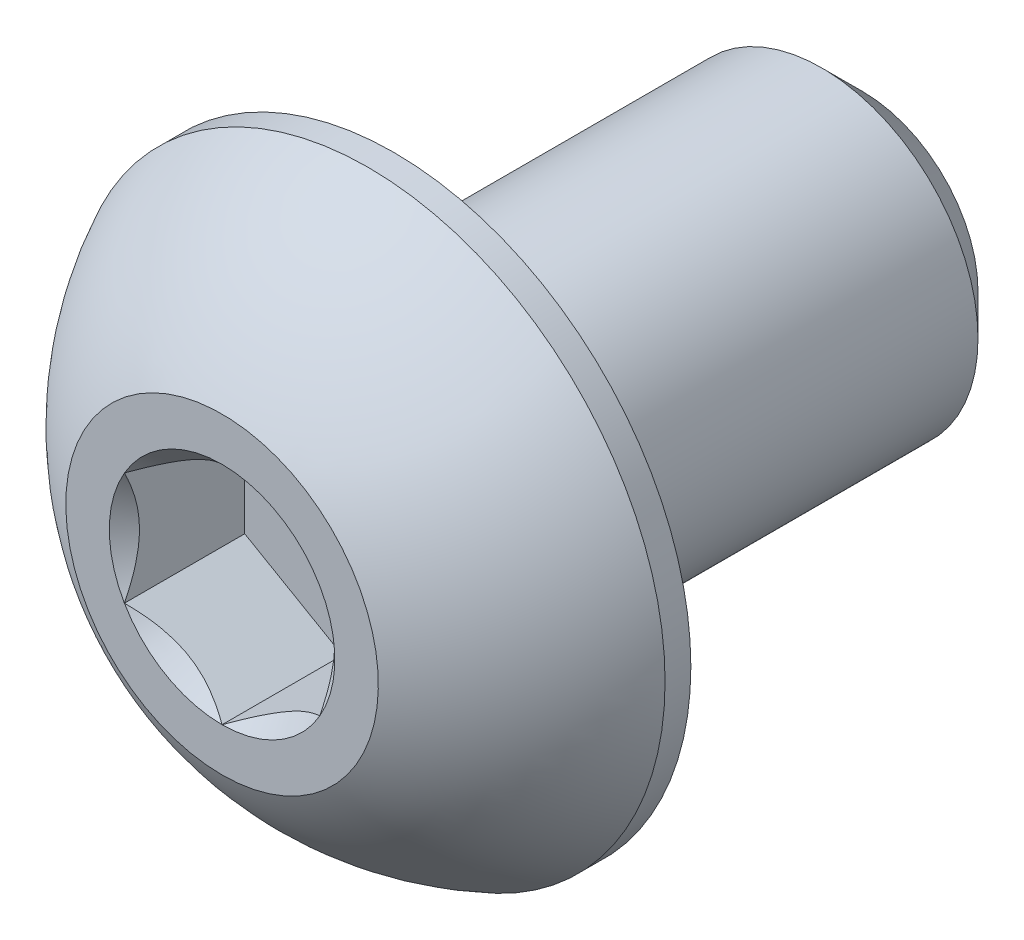
ISO-10303-21;
HEADER;
FILE_DESCRIPTION(('STEP AP214'),'2;1');
FILE_NAME('part.step','',(''),(''),'','','');
FILE_SCHEMA(('AUTOMOTIVE_DESIGN { 1 0 10303 214 1 1 1 1 }'));
ENDSEC;
DATA;
#1=APPLICATION_CONTEXT('core data for automotive mechanical design processes');
#2=APPLICATION_PROTOCOL_DEFINITION('international standard','automotive_design',2000,#1);
#3=PRODUCT_CONTEXT('',#1,'mechanical');
#4=PRODUCT('Part','Part','',(#3));
#5=PRODUCT_RELATED_PRODUCT_CATEGORY('part','',(#4));
#6=PRODUCT_DEFINITION_FORMATION('','',#4);
#7=PRODUCT_DEFINITION_CONTEXT('part definition',#1,'design');
#8=PRODUCT_DEFINITION('design','',#6,#7);
#9=PRODUCT_DEFINITION_SHAPE('','',#8);
#10=(LENGTH_UNIT() NAMED_UNIT(*) SI_UNIT(.MILLI.,.METRE.));
#11=(NAMED_UNIT(*) PLANE_ANGLE_UNIT() SI_UNIT($,.RADIAN.));
#12=(NAMED_UNIT(*) SI_UNIT($,.STERADIAN.) SOLID_ANGLE_UNIT());
#13=UNCERTAINTY_MEASURE_WITH_UNIT(LENGTH_MEASURE(1.E-05),#10,'distance_accuracy_value','');
#14=(GEOMETRIC_REPRESENTATION_CONTEXT(3) GLOBAL_UNCERTAINTY_ASSIGNED_CONTEXT((#13)) GLOBAL_UNIT_ASSIGNED_CONTEXT((#10,
#11,#12)) REPRESENTATION_CONTEXT('',''));
#15=CARTESIAN_POINT('',(0.,0.,0.));
#16=DIRECTION('',(0.,0.,1.));
#17=DIRECTION('',(1.,0.,0.));
#18=AXIS2_PLACEMENT_3D('',#15,#16,#17);
#19=CARTESIAN_POINT('',(0.,0.,-8.2));
#20=DIRECTION('',(0.,0.,1.));
#21=DIRECTION('',(1.,0.,0.));
#22=AXIS2_PLACEMENT_3D('',#19,#20,#21);
#23=PLANE('',#22);
#24=CARTESIAN_POINT('',(0.,0.,-8.2));
#25=DIRECTION('',(0.,0.,1.));
#26=DIRECTION('',(1.,0.,0.));
#27=AXIS2_PLACEMENT_3D('',#24,#25,#26);
#28=CIRCLE('',#27,1.47500000000003);
#29=CARTESIAN_POINT('',(1.47500000000003,0.,-8.2));
#30=VERTEX_POINT('',#29);
#31=EDGE_CURVE('E49',#30,#30,#28,.T.);
#32=ORIENTED_EDGE('',*,*,#31,.F.);
#33=EDGE_LOOP('',(#32));
#34=FACE_BOUND('',#33,.T.);
#35=ADVANCED_FACE('F36',(#34),#23,.F.);
#36=CARTESIAN_POINT('',(0.,0.,-8.2));
#37=DIRECTION('',(0.,0.,1.));
#38=DIRECTION('',(1.,0.,0.));
#39=AXIS2_PLACEMENT_3D('',#36,#37,#38);
#40=CONICAL_SURFACE('',#39,1.47500000000003,0.785398163397434);
#41=CARTESIAN_POINT('',(0.,0.,-7.675));
#42=DIRECTION('',(0.,0.,1.));
#43=DIRECTION('',(1.,0.,0.));
#44=AXIS2_PLACEMENT_3D('',#41,#42,#43);
#45=CIRCLE('',#44,2.00000000000001);
#46=CARTESIAN_POINT('',(2.00000000000001,0.,-7.675));
#47=VERTEX_POINT('',#46);
#48=EDGE_CURVE('E175',#47,#47,#45,.T.);
#49=ORIENTED_EDGE('',*,*,#48,.F.);
#50=EDGE_LOOP('',(#49));
#51=FACE_BOUND('',#50,.T.);
#52=ORIENTED_EDGE('',*,*,#31,.T.);
#53=EDGE_LOOP('',(#52));
#54=FACE_BOUND('',#53,.T.);
#55=ADVANCED_FACE('F180',(#51,#54),#40,.T.);
#56=CARTESIAN_POINT('',(0.,0.,0.));
#57=DIRECTION('',(0.,0.,1.));
#58=DIRECTION('',(1.,0.,0.));
#59=AXIS2_PLACEMENT_3D('',#56,#57,#58);
#60=CYLINDRICAL_SURFACE('',#59,2.00000000000001);
#61=CARTESIAN_POINT('',(0.,0.,-2.2));
#62=DIRECTION('',(0.,0.,1.));
#63=DIRECTION('',(1.,0.,0.));
#64=AXIS2_PLACEMENT_3D('',#61,#62,#63);
#65=CIRCLE('',#64,2.00000000000001);
#66=CARTESIAN_POINT('',(2.00000000000001,0.,-2.2));
#67=VERTEX_POINT('',#66);
#68=EDGE_CURVE('E172',#67,#67,#65,.T.);
#69=ORIENTED_EDGE('',*,*,#68,.F.);
#70=EDGE_LOOP('',(#69));
#71=FACE_BOUND('',#70,.T.);
#72=ORIENTED_EDGE('',*,*,#48,.T.);
#73=EDGE_LOOP('',(#72));
#74=FACE_BOUND('',#73,.T.);
#75=ADVANCED_FACE('F186',(#71,#74),#60,.T.);
#76=CARTESIAN_POINT('',(0.,-3.8,-2.2));
#77=DIRECTION('',(0.,0.,1.));
#78=DIRECTION('',(1.,0.,0.));
#79=AXIS2_PLACEMENT_3D('',#76,#77,#78);
#80=PLANE('',#79);
#81=CARTESIAN_POINT('',(0.,0.,-2.2));
#82=DIRECTION('',(0.,0.,1.));
#83=DIRECTION('',(1.,0.,0.));
#84=AXIS2_PLACEMENT_3D('',#81,#82,#83);
#85=CIRCLE('',#84,3.8);
#86=CARTESIAN_POINT('',(3.8,0.,-2.2));
#87=VERTEX_POINT('',#86);
#88=EDGE_CURVE('E166',#87,#87,#85,.T.);
#89=ORIENTED_EDGE('',*,*,#88,.F.);
#90=EDGE_LOOP('',(#89));
#91=FACE_BOUND('',#90,.T.);
#92=ORIENTED_EDGE('',*,*,#68,.T.);
#93=EDGE_LOOP('',(#92));
#94=FACE_BOUND('',#93,.T.);
#95=ADVANCED_FACE('F191',(#91,#94),#80,.F.);
#96=CARTESIAN_POINT('',(0.,0.,-3.72644385026738));
#97=DIRECTION('',(0.,0.,1.));
#98=DIRECTION('',(0.,-1.,0.));
#99=AXIS2_PLACEMENT_3D('',#96,#97,#98);
#100=SPHERICAL_SURFACE('',#99,4.22922968981299);
#101=CARTESIAN_POINT('',(0.,0.,0.));
#102=DIRECTION('',(0.,0.,1.));
#103=DIRECTION('',(1.,0.,0.));
#104=AXIS2_PLACEMENT_3D('',#101,#102,#103);
#105=CIRCLE('',#104,2.00000000000001);
#106=CARTESIAN_POINT('',(0.,-2.00000000000001,0.));
#107=VERTEX_POINT('',#106);
#108=EDGE_CURVE('E169',#107,#107,#105,.T.);
#109=CARTESIAN_POINT('',(0.,0.,-1.87));
#110=DIRECTION('',(0.,0.,1.));
#111=DIRECTION('',(1.,0.,0.));
#112=AXIS2_PLACEMENT_3D('',#109,#110,#111);
#113=CIRCLE('',#112,3.8);
#114=CARTESIAN_POINT('',(0.,-3.8,-1.87));
#115=VERTEX_POINT('',#114);
#116=EDGE_CURVE('E163',#115,#115,#113,.T.);
#117=CARTESIAN_POINT('',(0.,-2.00000000000001,0.));
#118=CARTESIAN_POINT('',(0.,-2.02421343985615,-0.0129954259644869));
#119=CARTESIAN_POINT('',(0.,-2.04830018323976,-0.0262269129651298));
#120=CARTESIAN_POINT('',(0.,-2.09621120342127,-0.0531568415057489));
#121=CARTESIAN_POINT('',(0.,-2.12003548021918,-0.0668552830457251));
#122=CARTESIAN_POINT('',(0.,-2.16741249358868,-0.0947139531320313));
#123=CARTESIAN_POINT('',(0.,-2.19096523016027,-0.108874181678362));
#124=CARTESIAN_POINT('',(0.,-2.23779021933684,-0.137651035235957));
#125=CARTESIAN_POINT('',(0.,-2.26106247194182,-0.152267660247222));
#126=CARTESIAN_POINT('',(0.,-2.30731764886073,-0.181951755514141));
#127=CARTESIAN_POINT('',(0.,-2.33030057317466,-0.197019225769796));
#128=CARTESIAN_POINT('',(0.,-2.37596836104236,-0.227599285582871));
#129=CARTESIAN_POINT('',(0.,-2.39865322459613,-0.243111875140292));
#130=CARTESIAN_POINT('',(0.,-2.44371627121514,-0.274576279395883));
#131=CARTESIAN_POINT('',(0.,-2.46609445428039,-0.290528094094054));
#132=CARTESIAN_POINT('',(0.,-2.51053563686182,-0.322864887331673));
#133=CARTESIAN_POINT('',(0.,-2.53259863637801,-0.339249865871121));
#134=CARTESIAN_POINT('',(0.,-2.57640106852493,-0.372446760967232));
#135=CARTESIAN_POINT('',(0.,-2.59814050115565,-0.389258677523893));
#136=CARTESIAN_POINT('',(0.,-2.64128753915154,-0.423303060588149));
#137=CARTESIAN_POINT('',(0.,-2.66269514451672,-0.440535527095743));
#138=CARTESIAN_POINT('',(0.,-2.70517039368396,-0.475414462202968));
#139=CARTESIAN_POINT('',(0.,-2.72623803748603,-0.493060930802598));
#140=CARTESIAN_POINT('',(0.,-2.76802535840619,-0.52876116492441));
#141=CARTESIAN_POINT('',(0.,-2.78874503552429,-0.546814930446591));
#142=CARTESIAN_POINT('',(0.,-2.82982855017314,-0.583322898482808));
#143=CARTESIAN_POINT('',(0.,-2.8501923877039,-0.601777100996845));
#144=CARTESIAN_POINT('',(0.,-2.89055648548395,-0.639078930931024));
#145=CARTESIAN_POINT('',(0.,-2.91055674573325,-0.657926558351167));
#146=CARTESIAN_POINT('',(0.,-2.95018608940553,-0.696008076521268));
#147=CARTESIAN_POINT('',(0.,-2.96981517282853,-0.715241967271226));
#148=CARTESIAN_POINT('',(0.,-3.00869470434028,-0.754088703755296));
#149=CARTESIAN_POINT('',(0.,-3.02794515242904,-0.773701549489407));
#150=CARTESIAN_POINT('',(0.,-3.06606009863533,-0.813298743603727));
#151=CARTESIAN_POINT('',(0.,-3.08492459675287,-0.833283091983936));
#152=CARTESIAN_POINT('',(0.,-3.12226047503003,-0.873615697891679));
#153=CARTESIAN_POINT('',(0.,-3.14073185518965,-0.893963955419214));
#154=CARTESIAN_POINT('',(0.,-3.17727447893822,-0.935016647847444));
#155=CARTESIAN_POINT('',(0.,-3.19534572252716,-0.95572108274814));
#156=CARTESIAN_POINT('',(0.,-3.23108120656243,-0.99747826281099));
#157=CARTESIAN_POINT('',(0.,-3.24874544700875,-1.01853100797314));
#158=CARTESIAN_POINT('',(0.,-3.28366021283673,-1.06097680909897));
#159=CARTESIAN_POINT('',(0.,-3.30091073821839,-1.08236986506264));
#160=CARTESIAN_POINT('',(0.,-3.33499151919534,-1.12548815902284));
#161=CARTESIAN_POINT('',(0.,-3.35182177479064,-1.14721339701936));
#162=CARTESIAN_POINT('',(0.,-3.38505562116372,-1.1909878000568));
#163=CARTESIAN_POINT('',(0.,-3.40145921194149,-1.21303696509771));
#164=CARTESIAN_POINT('',(0.,-3.43383349577047,-1.25745084415152));
#165=CARTESIAN_POINT('',(0.,-3.44980418882167,-1.27981555816441));
#166=CARTESIAN_POINT('',(0.,-3.48130660877275,-1.32485203719233));
#167=CARTESIAN_POINT('',(0.,-3.49683833567264,-1.34752380220736));
#168=CARTESIAN_POINT('',(0.,-3.52745692170932,-1.39316576858967));
#169=CARTESIAN_POINT('',(0.,-3.5425437808461,-1.41613596995695));
#170=CARTESIAN_POINT('',(0.,-3.57226689871518,-1.46236608103065));
#171=CARTESIAN_POINT('',(0.,-3.58690315744748,-1.48562599073709));
#172=CARTESIAN_POINT('',(0.,-3.615719513332,-1.5324266802666));
#173=CARTESIAN_POINT('',(0.,-3.62989961048422,-1.55596746008967));
#174=CARTESIAN_POINT('',(0.,-3.65779825442823,-1.6033209453859));
#175=CARTESIAN_POINT('',(0.,-3.67151680122002,-1.62713365085906));
#176=CARTESIAN_POINT('',(0.,-3.69848713452322,-1.67502193787766));
#177=CARTESIAN_POINT('',(0.,-3.71173892103461,-1.6990975194231));
#178=CARTESIAN_POINT('',(0.,-3.73777068821038,-1.74750241579215));
#179=CARTESIAN_POINT('',(0.,-3.75055066887474,-1.77183173061575));
#180=CARTESIAN_POINT('',(0.,-3.77563400658953,-1.82073482944519));
#181=CARTESIAN_POINT('',(0.,-3.78793736363997,-1.84530861345103));
#182=CARTESIAN_POINT('',(0.,-3.8,-1.87));
#183=B_SPLINE_CURVE_WITH_KNOTS('',3,(#117,#118,#119,#120,#121,#122,#123,#124,#125,#126,#127,
#128,#129,#130,#131,#132,#133,#134,#135,#136,#137,#138,#139,#140,#141,#142,#143,#144,#145,#146,
#147,#148,#149,#150,#151,#152,#153,#154,#155,#156,#157,#158,#159,#160,#161,#162,#163,#164,#165,
#166,#167,#168,#169,#170,#171,#172,#173,#174,#175,#176,#177,#178,#179,#180,#181,#182),
.UNSPECIFIED.,.F.,.F.,(4,2,2,2,2,2,2,2,2,2,2,2,2,2,2,2,2,2,2,2,2,2,2,2,2,2,2,2,2,2,2,2,4),(0.,
0.0824398589102638,0.164879717820528,0.247319576730792,0.329759435641056,0.41219929455132,
0.494639153461583,0.577079012371847,0.659518871282112,0.741958730192376,0.82439858910264,
0.906838448012904,0.989278306923168,1.07171816583343,1.1541580247437,1.23659788365396,
1.31903774256422,1.40147760147449,1.48391746038475,1.56635731929502,1.64879717820528,
1.73123703711554,1.81367689602581,1.89611675493607,1.97855661384634,2.0609964727566,
2.14343633166686,2.22587619057713,2.30831604948739,2.39075590839766,2.47319576730792,
2.55563562621818,2.63807548512845),.UNSPECIFIED.);
#184=EDGE_CURVE('BSEAM196',#107,#115,#183,.T.);
#185=ORIENTED_EDGE('',*,*,#108,.F.);
#186=ORIENTED_EDGE('',*,*,#116,.T.);
#187=ORIENTED_EDGE('',*,*,#184,.T.);
#188=ORIENTED_EDGE('',*,*,#184,.F.);
#189=EDGE_LOOP('',(#185,#187,#186,#188));
#190=FACE_BOUND('',#189,.T.);
#191=ADVANCED_FACE('F196',(#190),#100,.T.);
#192=CARTESIAN_POINT('',(0.,-2.00000000000001,0.));
#193=DIRECTION('',(0.,0.,-1.));
#194=DIRECTION('',(-1.,0.,0.));
#195=AXIS2_PLACEMENT_3D('',#192,#193,#194);
#196=PLANE('',#195);
#197=CARTESIAN_POINT('',(0.,0.,0.));
#198=DIRECTION('',(0.,0.,1.));
#199=DIRECTION('',(1.,0.,0.));
#200=AXIS2_PLACEMENT_3D('',#197,#198,#199);
#201=CIRCLE('',#200,1.44337567297406);
#202=CARTESIAN_POINT('',(-1.25,0.721687836487031,0.));
#203=VERTEX_POINT('',#202);
#204=CARTESIAN_POINT('',(-1.25,-0.721687836487033,0.));
#205=VERTEX_POINT('',#204);
#206=EDGE_CURVE('E62',#203,#205,#201,.T.);
#207=ORIENTED_EDGE('',*,*,#206,.F.);
#208=CARTESIAN_POINT('',(0.,1.44337567297406,0.));
#209=VERTEX_POINT('',#208);
#210=EDGE_CURVE('E134',#209,#203,#201,.T.);
#211=ORIENTED_EDGE('',*,*,#210,.F.);
#212=CARTESIAN_POINT('',(1.25,0.721687836487029,0.));
#213=VERTEX_POINT('',#212);
#214=EDGE_CURVE('E131',#213,#209,#201,.T.);
#215=ORIENTED_EDGE('',*,*,#214,.F.);
#216=CARTESIAN_POINT('',(1.25,-0.721687836487029,0.));
#217=VERTEX_POINT('',#216);
#218=EDGE_CURVE('E102',#217,#213,#201,.T.);
#219=ORIENTED_EDGE('',*,*,#218,.F.);
#220=CARTESIAN_POINT('',(0.,-1.44337567297406,0.));
#221=VERTEX_POINT('',#220);
#222=EDGE_CURVE('E94',#221,#217,#201,.T.);
#223=ORIENTED_EDGE('',*,*,#222,.F.);
#224=EDGE_CURVE('E55',#205,#221,#201,.T.);
#225=ORIENTED_EDGE('',*,*,#224,.F.);
#226=EDGE_LOOP('',(#207,#211,#215,#219,#223,#225));
#227=FACE_BOUND('',#226,.T.);
#228=ORIENTED_EDGE('',*,*,#108,.T.);
#229=EDGE_LOOP('',(#228));
#230=FACE_BOUND('',#229,.T.);
#231=ADVANCED_FACE('F128',(#227,#230),#196,.F.);
#232=CARTESIAN_POINT('',(0.,0.,0.));
#233=DIRECTION('',(0.,0.,1.));
#234=DIRECTION('',(1.,0.,0.));
#235=AXIS2_PLACEMENT_3D('',#232,#233,#234);
#236=CYLINDRICAL_SURFACE('',#235,3.8);
#237=ORIENTED_EDGE('',*,*,#116,.F.);
#238=EDGE_LOOP('',(#237));
#239=FACE_BOUND('',#238,.T.);
#240=ORIENTED_EDGE('',*,*,#88,.T.);
#241=EDGE_LOOP('',(#240));
#242=FACE_BOUND('',#241,.T.);
#243=ADVANCED_FACE('F202',(#239,#242),#236,.T.);
#244=CARTESIAN_POINT('',(0.,0.,0.));
#245=DIRECTION('',(0.,0.,1.));
#246=DIRECTION('',(1.,0.,0.));
#247=AXIS2_PLACEMENT_3D('',#244,#245,#246);
#248=CONICAL_SURFACE('',#247,1.44337567297406,0.78539816339745);
#249=ORIENTED_EDGE('',*,*,#218,.T.);
#250=CARTESIAN_POINT('',(1.25,-1.43934010808076,0.462982096892323));
#251=CARTESIAN_POINT('',(1.25,-1.40429313005658,0.436524922632886));
#252=CARTESIAN_POINT('',(1.25,-1.36905087135598,0.410327160354276));
#253=CARTESIAN_POINT('',(1.25,-1.2980965070631,0.358557571839581));
#254=CARTESIAN_POINT('',(1.25,-1.26238428576495,0.332985904356291));
#255=CARTESIAN_POINT('',(1.25,-1.15390111792707,0.257005993689462));
#256=CARTESIAN_POINT('',(1.25,-1.08031646726264,0.207740286189565));
#257=CARTESIAN_POINT('',(1.25,-0.926012322755091,0.111025830263131));
#258=CARTESIAN_POINT('',(1.25,-0.845125318656143,0.0638412989417957));
#259=CARTESIAN_POINT('',(1.25,-0.679311174076599,-0.0224692656095865));
#260=CARTESIAN_POINT('',(1.25,-0.594398891026685,-0.0616224653730992));
#261=CARTESIAN_POINT('',(1.25,-0.466944812460738,-0.109522776311707));
#262=CARTESIAN_POINT('',(1.25,-0.426289985812819,-0.123270510213663));
#263=CARTESIAN_POINT('',(1.25,-0.343998850091265,-0.147502072549456));
#264=CARTESIAN_POINT('',(1.25,-0.30236247361496,-0.157985676130227));
#265=CARTESIAN_POINT('',(1.25,-0.219052696285663,-0.174969838251702));
#266=CARTESIAN_POINT('',(1.25,-0.177393428474498,-0.18153863952863));
#267=CARTESIAN_POINT('',(1.25,-0.0936293693401902,-0.190564946542239));
#268=CARTESIAN_POINT('',(1.25,-0.0515246558543941,-0.193023159002731));
#269=CARTESIAN_POINT('',(1.25,0.0311890576306333,-0.193645937986714));
#270=CARTESIAN_POINT('',(1.25,0.071796962549932,-0.191962883153752));
#271=CARTESIAN_POINT('',(1.25,0.152668636885198,-0.184731729402085));
#272=CARTESIAN_POINT('',(1.25,0.192932338835359,-0.179182889586891));
#273=CARTESIAN_POINT('',(1.25,0.273499879165296,-0.164428963535045));
#274=CARTESIAN_POINT('',(1.25,0.313792180618512,-0.155161824035893));
#275=CARTESIAN_POINT('',(1.25,0.393496413911458,-0.133463821542651));
#276=CARTESIAN_POINT('',(1.25,0.43290841911506,-0.121033223269353));
#277=CARTESIAN_POINT('',(1.25,0.556992735862299,-0.0772206470685609));
#278=CARTESIAN_POINT('',(1.25,0.639898924666086,-0.0408489271240422));
#279=CARTESIAN_POINT('',(1.25,0.801816555499702,0.0400191621783368));
#280=CARTESIAN_POINT('',(1.25,0.880812666325045,0.084544720911988));
#281=CARTESIAN_POINT('',(1.25,1.0317856127975,0.176404876666627));
#282=CARTESIAN_POINT('',(1.25,1.10391618485086,0.223489933916251));
#283=CARTESIAN_POINT('',(1.25,1.21018606043311,0.29627856159854));
#284=CARTESIAN_POINT('',(1.25,1.24515069969379,0.32079808539336));
#285=CARTESIAN_POINT('',(1.25,1.31460220852737,0.370485636765682));
#286=CARTESIAN_POINT('',(1.25,1.34908920596618,0.395653485415522));
#287=CARTESIAN_POINT('',(1.25,1.38337731682912,0.421090148841215));
#288=B_SPLINE_CURVE_WITH_KNOTS('',3,(#250,#251,#252,#253,#254,#255,#256,#257,#258,#259,#260,
#261,#262,#263,#264,#265,#266,#267,#268,#269,#270,#271,#272,#273,#274,#275,#276,#277,#278,#279,
#280,#281,#282,#283,#284,#285,#286,#287),.UNSPECIFIED.,.F.,.F.,(4,2,2,2,2,2,2,2,2,2,2,2,2,2,2,2,
2,2,4),(0.,0.131732960381447,0.263498984161643,0.529042014455823,0.809741926134614,
1.08947609717225,1.21811634272576,1.346765447839,1.47310084517843,1.59941451973784,
1.72115042167849,1.84290966131734,1.96679153905341,2.09066305366038,2.36146692896008,
2.6332598919849,2.89154668212278,3.01965734507712,3.14773302245627),.UNSPECIFIED.);
#289=EDGE_CURVE('E11',#217,#213,#288,.T.);
#290=ORIENTED_EDGE('',*,*,#289,.F.);
#291=EDGE_LOOP('',(#249,#290));
#292=FACE_BOUND('',#291,.T.);
#293=ADVANCED_FACE('F106',(#292),#248,.F.);
#294=ORIENTED_EDGE('',*,*,#214,.T.);
#295=CARTESIAN_POINT('',(1.2502,0.721572366433193,0.000115483909137106));
#296=CARTESIAN_POINT('',(1.20722483292841,0.746384090710443,-0.0246783319448953));
#297=CARTESIAN_POINT('',(1.16353099525405,0.771610739653663,-0.0480162655813155));
#298=CARTESIAN_POINT('',(1.07443406915806,0.823050873919154,-0.0907479959154626));
#299=CARTESIAN_POINT('',(1.02902250164294,0.849269254648332,-0.110118007639585));
#300=CARTESIAN_POINT('',(0.93745217906474,0.902137405038635,-0.143299516586522));
#301=CARTESIAN_POINT('',(0.891316759824114,0.928773701756386,-0.157194440947344));
#302=CARTESIAN_POINT('',(0.798029919592407,0.982632884076012,-0.178602717839361));
#303=CARTESIAN_POINT('',(0.75088135086362,1.00985412292348,-0.186132058433213));
#304=CARTESIAN_POINT('',(0.669626443112747,1.05676666578643,-0.192925501949297));
#305=CARTESIAN_POINT('',(0.635625123372058,1.07639733689152,-0.19393144089565));
#306=CARTESIAN_POINT('',(0.567682235567522,1.11562418145499,-0.192238585088681));
#307=CARTESIAN_POINT('',(0.533740682344342,1.1352203463451,-0.189538972784461));
#308=CARTESIAN_POINT('',(0.4661851435425,1.1742235548576,-0.180591069683622));
#309=CARTESIAN_POINT('',(0.432571492713225,1.19363040521232,-0.174339474100294));
#310=CARTESIAN_POINT('',(0.365905361782186,1.23212011385119,-0.158624318586096));
#311=CARTESIAN_POINT('',(0.332853128969704,1.2512028293628,-0.149159379912542));
#312=CARTESIAN_POINT('',(0.248200308399735,1.30007715810653,-0.121068609312414));
#313=CARTESIAN_POINT('',(0.197133507570362,1.32956058931202,-0.100329842547799));
#314=CARTESIAN_POINT('',(0.0969991458867455,1.38737318998519,-0.0536128653285237));
#315=CARTESIAN_POINT('',(0.0479256884217311,1.41570576386268,-0.0276517040532341));
#316=CARTESIAN_POINT('',(-0.000199999999999383,1.4434911430279,0.000115483909135572));
#317=B_SPLINE_CURVE_WITH_KNOTS('',3,(#295,#296,#297,#298,#299,#300,#301,#302,#303,#304,#305,
#306,#307,#308,#309,#310,#311,#312,#313,#314,#315,#316),.UNSPECIFIED.,.F.,.F.,(4,2,2,2,2,2,2,2,
2,2,4),(0.,0.166533409618304,0.334037607289762,0.498880396489699,0.663307919240276,
0.780963963458828,0.898645970148454,1.01643764860773,1.1342799317155,1.32148652032141,
1.50809158792573),.UNSPECIFIED.);
#318=EDGE_CURVE('E133',#213,#209,#317,.T.);
#319=ORIENTED_EDGE('',*,*,#318,.F.);
#320=EDGE_LOOP('',(#294,#319));
#321=FACE_BOUND('',#320,.T.);
#322=ADVANCED_FACE('F289',(#321),#248,.F.);
#323=ORIENTED_EDGE('',*,*,#210,.T.);
#324=CARTESIAN_POINT('',(0.000200000000000433,1.4434911430279,0.000115483909135892));
#325=CARTESIAN_POINT('',(-0.0427751670715862,1.41867941875065,-0.0246783319448965));
#326=CARTESIAN_POINT('',(-0.0864690047459474,1.39345276980743,-0.0480162655813166));
#327=CARTESIAN_POINT('',(-0.175565930841941,1.34201263554194,-0.0907479959154634));
#328=CARTESIAN_POINT('',(-0.220977498357063,1.31579425481276,-0.110118007639586));
#329=CARTESIAN_POINT('',(-0.312547820935259,1.26292610442246,-0.143299516586523));
#330=CARTESIAN_POINT('',(-0.358683240175885,1.23628980770471,-0.157194440947344));
#331=CARTESIAN_POINT('',(-0.451970080407591,1.18243062538508,-0.178602717839361));
#332=CARTESIAN_POINT('',(-0.499118649136379,1.15520938653761,-0.186132058433213));
#333=CARTESIAN_POINT('',(-0.580373556887251,1.10829684367467,-0.192925501949298));
#334=CARTESIAN_POINT('',(-0.61437487662794,1.08866617256958,-0.193931440895651));
#335=CARTESIAN_POINT('',(-0.682317764432476,1.04943932800611,-0.192238585088682));
#336=CARTESIAN_POINT('',(-0.716259317655656,1.02984316311599,-0.189538972784462));
#337=CARTESIAN_POINT('',(-0.783814856457498,0.990839954603498,-0.180591069683623));
#338=CARTESIAN_POINT('',(-0.817428507286774,0.97143310424877,-0.174339474100295));
#339=CARTESIAN_POINT('',(-0.884094638217812,0.932943395609904,-0.158624318586097));
#340=CARTESIAN_POINT('',(-0.917146871030294,0.913860680098299,-0.149159379912542));
#341=CARTESIAN_POINT('',(-1.00179969160026,0.864986351354567,-0.121068609312415));
#342=CARTESIAN_POINT('',(-1.05286649242964,0.835502920149075,-0.1003298425478));
#343=CARTESIAN_POINT('',(-1.15300085411325,0.777690319475907,-0.0536128653285245));
#344=CARTESIAN_POINT('',(-1.20207431157827,0.749357745598416,-0.0276517040532348));
#345=CARTESIAN_POINT('',(-1.2502,0.721572366433194,0.000115483909135054));
#346=B_SPLINE_CURVE_WITH_KNOTS('',3,(#324,#325,#326,#327,#328,#329,#330,#331,#332,#333,#334,
#335,#336,#337,#338,#339,#340,#341,#342,#343,#344,#345),.UNSPECIFIED.,.F.,.F.,(4,2,2,2,2,2,2,2,
2,2,4),(0.,0.166533409618303,0.334037607289761,0.498880396489697,0.663307919240274,
0.780963963458826,0.898645970148452,1.01643764860773,1.13427993171549,1.32148652032141,
1.50809158792573),.UNSPECIFIED.);
#347=EDGE_CURVE('E138',#209,#203,#346,.T.);
#348=ORIENTED_EDGE('',*,*,#347,.F.);
#349=EDGE_LOOP('',(#323,#348));
#350=FACE_BOUND('',#349,.T.);
#351=ADVANCED_FACE('F141',(#350),#248,.F.);
#352=ORIENTED_EDGE('',*,*,#206,.T.);
#353=CARTESIAN_POINT('',(-1.25,-1.43934010808077,0.462982096892325));
#354=CARTESIAN_POINT('',(-1.25,-1.40429313005658,0.436524922632887));
#355=CARTESIAN_POINT('',(-1.25,-1.36905087135599,0.410327160354277));
#356=CARTESIAN_POINT('',(-1.25,-1.29809650706311,0.358557571839583));
#357=CARTESIAN_POINT('',(-1.25,-1.26238428576495,0.332985904356292));
#358=CARTESIAN_POINT('',(-1.25,-1.15390111792708,0.257005993689462));
#359=CARTESIAN_POINT('',(-1.25,-1.08031646726264,0.207740286189565));
#360=CARTESIAN_POINT('',(-1.25,-0.926012322755094,0.11102583026313));
#361=CARTESIAN_POINT('',(-1.25,-0.845125318656146,0.0638412989417953));
#362=CARTESIAN_POINT('',(-1.25,-0.679311174076601,-0.0224692656095875));
#363=CARTESIAN_POINT('',(-1.25,-0.594398891026687,-0.0616224653731005));
#364=CARTESIAN_POINT('',(-1.25,-0.46694481246074,-0.109522776311709));
#365=CARTESIAN_POINT('',(-1.25,-0.426289985812821,-0.123270510213665));
#366=CARTESIAN_POINT('',(-1.25,-0.343998850091267,-0.147502072549458));
#367=CARTESIAN_POINT('',(-1.25,-0.302362473614962,-0.157985676130229));
#368=CARTESIAN_POINT('',(-1.25,-0.219052696285665,-0.174969838251704));
#369=CARTESIAN_POINT('',(-1.25,-0.1773934284745,-0.181538639528632));
#370=CARTESIAN_POINT('',(-1.25,-0.0936293693401922,-0.190564946542242));
#371=CARTESIAN_POINT('',(-1.25,-0.051524655854396,-0.193023159002733));
#372=CARTESIAN_POINT('',(-1.25,0.0311890576306315,-0.193645937986716));
#373=CARTESIAN_POINT('',(-1.25,0.0717969625499304,-0.191962883153754));
#374=CARTESIAN_POINT('',(-1.25,0.152668636885197,-0.184731729402088));
#375=CARTESIAN_POINT('',(-1.25,0.192932338835358,-0.179182889586893));
#376=CARTESIAN_POINT('',(-1.25,0.273499879165295,-0.164428963535048));
#377=CARTESIAN_POINT('',(-1.25,0.313792180618511,-0.155161824035896));
#378=CARTESIAN_POINT('',(-1.25,0.393496413911457,-0.133463821542654));
#379=CARTESIAN_POINT('',(-1.25,0.432908419115058,-0.121033223269356));
#380=CARTESIAN_POINT('',(-1.25,0.556992735862297,-0.0772206470685636));
#381=CARTESIAN_POINT('',(-1.25,0.639898924666085,-0.0408489271240449));
#382=CARTESIAN_POINT('',(-1.25,0.8018165554997,0.040019162178334));
#383=CARTESIAN_POINT('',(-1.25,0.880812666325043,0.084544720911985));
#384=CARTESIAN_POINT('',(-1.25,1.0317856127975,0.176404876666624));
#385=CARTESIAN_POINT('',(-1.25,1.10391618485086,0.223489933916248));
#386=CARTESIAN_POINT('',(-1.25,1.2101860604331,0.296278561598537));
#387=CARTESIAN_POINT('',(-1.25,1.24515069969379,0.320798085393357));
#388=CARTESIAN_POINT('',(-1.25,1.31460220852736,0.370485636765679));
#389=CARTESIAN_POINT('',(-1.25,1.34908920596618,0.395653485415518));
#390=CARTESIAN_POINT('',(-1.25,1.38337731682911,0.421090148841212));
#391=B_SPLINE_CURVE_WITH_KNOTS('',3,(#353,#354,#355,#356,#357,#358,#359,#360,#361,#362,#363,
#364,#365,#366,#367,#368,#369,#370,#371,#372,#373,#374,#375,#376,#377,#378,#379,#380,#381,#382,
#383,#384,#385,#386,#387,#388,#389,#390),.UNSPECIFIED.,.F.,.F.,(4,2,2,2,2,2,2,2,2,2,2,2,2,2,2,2,
2,2,4),(0.,0.131732960381448,0.263498984161644,0.529042014455824,0.809741926134617,
1.08947609717225,1.21811634272576,1.346765447839,1.47310084517844,1.59941451973784,
1.72115042167849,1.84290966131735,1.96679153905341,2.09066305366039,2.36146692896009,
2.63325989198491,2.89154668212279,3.01965734507712,3.14773302245628),.UNSPECIFIED.);
#392=EDGE_CURVE('E145',#203,#205,#391,.F.);
#393=ORIENTED_EDGE('',*,*,#392,.F.);
#394=EDGE_LOOP('',(#352,#393));
#395=FACE_BOUND('',#394,.T.);
#396=ADVANCED_FACE('F283',(#395),#248,.F.);
#397=ORIENTED_EDGE('',*,*,#224,.T.);
#398=CARTESIAN_POINT('',(-1.2502,-0.721572366433194,0.000115483909134937));
#399=CARTESIAN_POINT('',(-1.20722483292841,-0.746384090710444,-0.0246783319448973));
#400=CARTESIAN_POINT('',(-1.16353099525405,-0.771610739653664,-0.0480162655813174));
#401=CARTESIAN_POINT('',(-1.07443406915806,-0.823050873919154,-0.0907479959154642));
#402=CARTESIAN_POINT('',(-1.02902250164293,-0.849269254648332,-0.110118007639587));
#403=CARTESIAN_POINT('',(-0.937452179064738,-0.902137405038635,-0.143299516586524));
#404=CARTESIAN_POINT('',(-0.891316759824113,-0.928773701756386,-0.157194440947345));
#405=CARTESIAN_POINT('',(-0.798029919592406,-0.982632884076012,-0.178602717839362));
#406=CARTESIAN_POINT('',(-0.750881350863619,-1.00985412292348,-0.186132058433214));
#407=CARTESIAN_POINT('',(-0.669626443112746,-1.05676666578643,-0.192925501949298));
#408=CARTESIAN_POINT('',(-0.635625123372058,-1.07639733689152,-0.193931440895651));
#409=CARTESIAN_POINT('',(-0.567682235567521,-1.11562418145499,-0.192238585088682));
#410=CARTESIAN_POINT('',(-0.533740682344341,-1.1352203463451,-0.189538972784462));
#411=CARTESIAN_POINT('',(-0.466185143542499,-1.1742235548576,-0.180591069683623));
#412=CARTESIAN_POINT('',(-0.432571492713224,-1.19363040521232,-0.174339474100295));
#413=CARTESIAN_POINT('',(-0.365905361782186,-1.23212011385119,-0.158624318586096));
#414=CARTESIAN_POINT('',(-0.332853128969703,-1.25120282936279,-0.149159379912542));
#415=CARTESIAN_POINT('',(-0.248200308399735,-1.30007715810653,-0.121068609312415));
#416=CARTESIAN_POINT('',(-0.197133507570361,-1.32956058931202,-0.1003298425478));
#417=CARTESIAN_POINT('',(-0.0969991458867451,-1.38737318998519,-0.0536128653285245));
#418=CARTESIAN_POINT('',(-0.0479256884217308,-1.41570576386268,-0.0276517040532348));
#419=CARTESIAN_POINT('',(0.000199999999999627,-1.4434911430279,0.000115483909135029));
#420=B_SPLINE_CURVE_WITH_KNOTS('',3,(#398,#399,#400,#401,#402,#403,#404,#405,#406,#407,#408,
#409,#410,#411,#412,#413,#414,#415,#416,#417,#418,#419),.UNSPECIFIED.,.F.,.F.,(4,2,2,2,2,2,2,2,
2,2,4),(0.,0.166533409618303,0.334037607289761,0.498880396489697,0.663307919240273,
0.780963963458825,0.898645970148451,1.01643764860773,1.13427993171549,1.32148652032141,
1.50809158792573),.UNSPECIFIED.);
#421=EDGE_CURVE('E118',#205,#221,#420,.T.);
#422=ORIENTED_EDGE('',*,*,#421,.F.);
#423=EDGE_LOOP('',(#397,#422));
#424=FACE_BOUND('',#423,.T.);
#425=ADVANCED_FACE('F231',(#424),#248,.F.);
#426=ORIENTED_EDGE('',*,*,#222,.T.);
#427=CARTESIAN_POINT('',(-0.000200000000000326,-1.4434911430279,0.000115483909135025));
#428=CARTESIAN_POINT('',(0.0427751670715863,-1.41867941875065,-0.0246783319448973));
#429=CARTESIAN_POINT('',(0.0864690047459475,-1.39345276980743,-0.0480162655813174));
#430=CARTESIAN_POINT('',(0.175565930841941,-1.34201263554194,-0.0907479959154642));
#431=CARTESIAN_POINT('',(0.220977498357063,-1.31579425481276,-0.110118007639587));
#432=CARTESIAN_POINT('',(0.312547820935259,-1.26292610442246,-0.143299516586524));
#433=CARTESIAN_POINT('',(0.358683240175885,-1.23628980770471,-0.157194440947345));
#434=CARTESIAN_POINT('',(0.451970080407591,-1.18243062538508,-0.178602717839362));
#435=CARTESIAN_POINT('',(0.499118649136378,-1.15520938653761,-0.186132058433214));
#436=CARTESIAN_POINT('',(0.580373556887251,-1.10829684367467,-0.192925501949298));
#437=CARTESIAN_POINT('',(0.614374876627939,-1.08866617256958,-0.193931440895651));
#438=CARTESIAN_POINT('',(0.682317764432476,-1.04943932800611,-0.192238585088682));
#439=CARTESIAN_POINT('',(0.716259317655656,-1.02984316311599,-0.189538972784463));
#440=CARTESIAN_POINT('',(0.783814856457498,-0.990839954603497,-0.180591069683624));
#441=CARTESIAN_POINT('',(0.817428507286773,-0.971433104248769,-0.174339474100296));
#442=CARTESIAN_POINT('',(0.884094638217811,-0.932943395609904,-0.158624318586097));
#443=CARTESIAN_POINT('',(0.917146871030293,-0.913860680098299,-0.149159379912543));
#444=CARTESIAN_POINT('',(1.00179969160026,-0.864986351354566,-0.121068609312415));
#445=CARTESIAN_POINT('',(1.05286649242964,-0.835502920149074,-0.100329842547801));
#446=CARTESIAN_POINT('',(1.15300085411325,-0.777690319475906,-0.0536128653285243));
#447=CARTESIAN_POINT('',(1.20207431157827,-0.749357745598414,-0.0276517040532342));
#448=CARTESIAN_POINT('',(1.2502,-0.721572366433191,0.00011548390913593));
#449=B_SPLINE_CURVE_WITH_KNOTS('',3,(#427,#428,#429,#430,#431,#432,#433,#434,#435,#436,#437,
#438,#439,#440,#441,#442,#443,#444,#445,#446,#447,#448),.UNSPECIFIED.,.F.,.F.,(4,2,2,2,2,2,2,2,
2,2,4),(0.,0.166533409618303,0.334037607289761,0.498880396489697,0.663307919240273,
0.780963963458825,0.898645970148451,1.01643764860773,1.13427993171549,1.32148652032141,
1.50809158792574),.UNSPECIFIED.);
#450=EDGE_CURVE('E98',#221,#217,#449,.T.);
#451=ORIENTED_EDGE('',*,*,#450,.F.);
#452=EDGE_LOOP('',(#426,#451));
#453=FACE_BOUND('',#452,.T.);
#454=ADVANCED_FACE('F96',(#453),#248,.F.);
#455=CARTESIAN_POINT('',(1.25,-0.721687836487029,-1.54));
#456=DIRECTION('',(0.,0.,1.));
#457=DIRECTION('',(1.,0.,0.));
#458=AXIS2_PLACEMENT_3D('',#455,#456,#457);
#459=PLANE('',#458);
#460=DIRECTION('',(0.866025403784438,0.5,0.));
#461=VECTOR('',#460,1.);
#462=CARTESIAN_POINT('',(0.,-1.44337567297406,-1.54));
#463=LINE('',#462,#461);
#464=CARTESIAN_POINT('',(0.,-1.44337567297406,-1.54));
#465=VERTEX_POINT('',#464);
#466=CARTESIAN_POINT('',(1.25,-0.721687836487029,-1.54));
#467=VERTEX_POINT('',#466);
#468=EDGE_CURVE('E117',#465,#467,#463,.T.);
#469=ORIENTED_EDGE('',*,*,#468,.T.);
#470=DIRECTION('',(0.,1.,0.));
#471=VECTOR('',#470,1.);
#472=CARTESIAN_POINT('',(1.25,-0.721687836487029,-1.54));
#473=LINE('',#472,#471);
#474=CARTESIAN_POINT('',(1.25,0.721687836487031,-1.54));
#475=VERTEX_POINT('',#474);
#476=EDGE_CURVE('E122',#467,#475,#473,.T.);
#477=ORIENTED_EDGE('',*,*,#476,.T.);
#478=DIRECTION('',(-0.866025403784439,0.5,0.));
#479=VECTOR('',#478,1.);
#480=CARTESIAN_POINT('',(1.25,0.721687836487031,-1.54));
#481=LINE('',#480,#479);
#482=CARTESIAN_POINT('',(0.,1.44337567297406,-1.54));
#483=VERTEX_POINT('',#482);
#484=EDGE_CURVE('E273',#475,#483,#481,.T.);
#485=ORIENTED_EDGE('',*,*,#484,.T.);
#486=DIRECTION('',(-0.866025403784439,-0.5,0.));
#487=VECTOR('',#486,1.);
#488=CARTESIAN_POINT('',(0.,1.44337567297406,-1.54));
#489=LINE('',#488,#487);
#490=CARTESIAN_POINT('',(-1.25,0.721687836487031,-1.54));
#491=VERTEX_POINT('',#490);
#492=EDGE_CURVE('E154',#483,#491,#489,.T.);
#493=ORIENTED_EDGE('',*,*,#492,.T.);
#494=DIRECTION('',(0.,-1.,0.));
#495=VECTOR('',#494,1.);
#496=CARTESIAN_POINT('',(-1.25,0.721687836487031,-1.54));
#497=LINE('',#496,#495);
#498=CARTESIAN_POINT('',(-1.25,-0.721687836487032,-1.54));
#499=VERTEX_POINT('',#498);
#500=EDGE_CURVE('E277',#491,#499,#497,.T.);
#501=ORIENTED_EDGE('',*,*,#500,.T.);
#502=DIRECTION('',(0.866025403784439,-0.5,0.));
#503=VECTOR('',#502,1.);
#504=CARTESIAN_POINT('',(-1.25,-0.721687836487032,-1.54));
#505=LINE('',#504,#503);
#506=EDGE_CURVE('E125',#499,#465,#505,.T.);
#507=ORIENTED_EDGE('',*,*,#506,.T.);
#508=EDGE_LOOP('',(#469,#477,#485,#493,#501,#507));
#509=FACE_BOUND('',#508,.T.);
#510=ADVANCED_FACE('F230',(#509),#459,.T.);
#511=CARTESIAN_POINT('',(1.25,-0.721687836487029,-1.54));
#512=DIRECTION('',(1.,0.,0.));
#513=DIRECTION('',(0.,0.,-1.));
#514=AXIS2_PLACEMENT_3D('',#511,#512,#513);
#515=PLANE('',#514);
#516=DIRECTION('',(0.,0.,1.));
#517=VECTOR('',#516,1.);
#518=CARTESIAN_POINT('',(1.25,-0.721687836487029,-1.54));
#519=LINE('',#518,#517);
#520=EDGE_CURVE('E114',#467,#217,#519,.T.);
#521=ORIENTED_EDGE('',*,*,#520,.T.);
#522=ORIENTED_EDGE('',*,*,#289,.T.);
#523=DIRECTION('',(0.,0.,1.));
#524=VECTOR('',#523,1.);
#525=CARTESIAN_POINT('',(1.25,0.721687836487031,-1.54));
#526=LINE('',#525,#524);
#527=EDGE_CURVE('E124',#475,#213,#526,.T.);
#528=ORIENTED_EDGE('',*,*,#527,.F.);
#529=ORIENTED_EDGE('',*,*,#476,.F.);
#530=EDGE_LOOP('',(#521,#522,#528,#529));
#531=FACE_BOUND('',#530,.T.);
#532=ADVANCED_FACE('F120',(#531),#515,.F.);
#533=CARTESIAN_POINT('',(1.25,0.721687836487031,-1.54));
#534=DIRECTION('',(0.5,0.866025403784439,0.));
#535=DIRECTION('',(-0.866025403784439,0.5,0.));
#536=AXIS2_PLACEMENT_3D('',#533,#534,#535);
#537=PLANE('',#536);
#538=ORIENTED_EDGE('',*,*,#527,.T.);
#539=ORIENTED_EDGE('',*,*,#318,.T.);
#540=DIRECTION('',(0.,0.,1.));
#541=VECTOR('',#540,1.);
#542=CARTESIAN_POINT('',(0.,1.44337567297406,-1.54));
#543=LINE('',#542,#541);
#544=EDGE_CURVE('E150',#483,#209,#543,.T.);
#545=ORIENTED_EDGE('',*,*,#544,.F.);
#546=ORIENTED_EDGE('',*,*,#484,.F.);
#547=EDGE_LOOP('',(#538,#539,#545,#546));
#548=FACE_BOUND('',#547,.T.);
#549=ADVANCED_FACE('F148',(#548),#537,.F.);
#550=CARTESIAN_POINT('',(0.,1.44337567297406,-1.54));
#551=DIRECTION('',(-0.5,0.866025403784438,0.));
#552=DIRECTION('',(-0.866025403784439,-0.5,0.));
#553=AXIS2_PLACEMENT_3D('',#550,#551,#552);
#554=PLANE('',#553);
#555=ORIENTED_EDGE('',*,*,#544,.T.);
#556=ORIENTED_EDGE('',*,*,#347,.T.);
#557=DIRECTION('',(0.,0.,1.));
#558=VECTOR('',#557,1.);
#559=CARTESIAN_POINT('',(-1.25,0.721687836487031,-1.54));
#560=LINE('',#559,#558);
#561=EDGE_CURVE('E156',#491,#203,#560,.T.);
#562=ORIENTED_EDGE('',*,*,#561,.F.);
#563=ORIENTED_EDGE('',*,*,#492,.F.);
#564=EDGE_LOOP('',(#555,#556,#562,#563));
#565=FACE_BOUND('',#564,.T.);
#566=ADVANCED_FACE('F152',(#565),#554,.F.);
#567=CARTESIAN_POINT('',(-1.25,0.721687836487031,-1.54));
#568=DIRECTION('',(-1.,0.,0.));
#569=DIRECTION('',(0.,-1.,0.));
#570=AXIS2_PLACEMENT_3D('',#567,#568,#569);
#571=PLANE('',#570);
#572=ORIENTED_EDGE('',*,*,#561,.T.);
#573=ORIENTED_EDGE('',*,*,#392,.T.);
#574=DIRECTION('',(0.,0.,1.));
#575=VECTOR('',#574,1.);
#576=CARTESIAN_POINT('',(-1.25,-0.721687836487032,-1.54));
#577=LINE('',#576,#575);
#578=EDGE_CURVE('E158',#499,#205,#577,.T.);
#579=ORIENTED_EDGE('',*,*,#578,.F.);
#580=ORIENTED_EDGE('',*,*,#500,.F.);
#581=EDGE_LOOP('',(#572,#573,#579,#580));
#582=FACE_BOUND('',#581,.T.);
#583=ADVANCED_FACE('F252',(#582),#571,.F.);
#584=CARTESIAN_POINT('',(-1.25,-0.721687836487032,-1.54));
#585=DIRECTION('',(-0.5,-0.866025403784439,0.));
#586=DIRECTION('',(0.866025403784439,-0.5,0.));
#587=AXIS2_PLACEMENT_3D('',#584,#585,#586);
#588=PLANE('',#587);
#589=ORIENTED_EDGE('',*,*,#578,.T.);
#590=ORIENTED_EDGE('',*,*,#421,.T.);
#591=DIRECTION('',(0.,0.,1.));
#592=VECTOR('',#591,1.);
#593=CARTESIAN_POINT('',(0.,-1.44337567297406,-1.54));
#594=LINE('',#593,#592);
#595=EDGE_CURVE('E116',#465,#221,#594,.T.);
#596=ORIENTED_EDGE('',*,*,#595,.F.);
#597=ORIENTED_EDGE('',*,*,#506,.F.);
#598=EDGE_LOOP('',(#589,#590,#596,#597));
#599=FACE_BOUND('',#598,.T.);
#600=ADVANCED_FACE('F211',(#599),#588,.F.);
#601=CARTESIAN_POINT('',(0.,-1.44337567297406,-1.54));
#602=DIRECTION('',(0.5,-0.866025403784438,0.));
#603=DIRECTION('',(0.866025403784439,0.5,0.));
#604=AXIS2_PLACEMENT_3D('',#601,#602,#603);
#605=PLANE('',#604);
#606=ORIENTED_EDGE('',*,*,#595,.T.);
#607=ORIENTED_EDGE('',*,*,#450,.T.);
#608=ORIENTED_EDGE('',*,*,#520,.F.);
#609=ORIENTED_EDGE('',*,*,#468,.F.);
#610=EDGE_LOOP('',(#606,#607,#608,#609));
#611=FACE_BOUND('',#610,.T.);
#612=ADVANCED_FACE('F112',(#611),#605,.F.);
#613=CLOSED_SHELL('',(#35,#55,#75,#95,#191,#231,#243,#293,#322,#351,#396,#425,#454,#510,#532,
#549,#566,#583,#600,#612));
#614=MANIFOLD_SOLID_BREP('B2',#613);
#615=ADVANCED_BREP_SHAPE_REPRESENTATION('',(#18,#614),#14);
#616=SHAPE_DEFINITION_REPRESENTATION(#9,#615);
ENDSEC;
END-ISO-10303-21;
